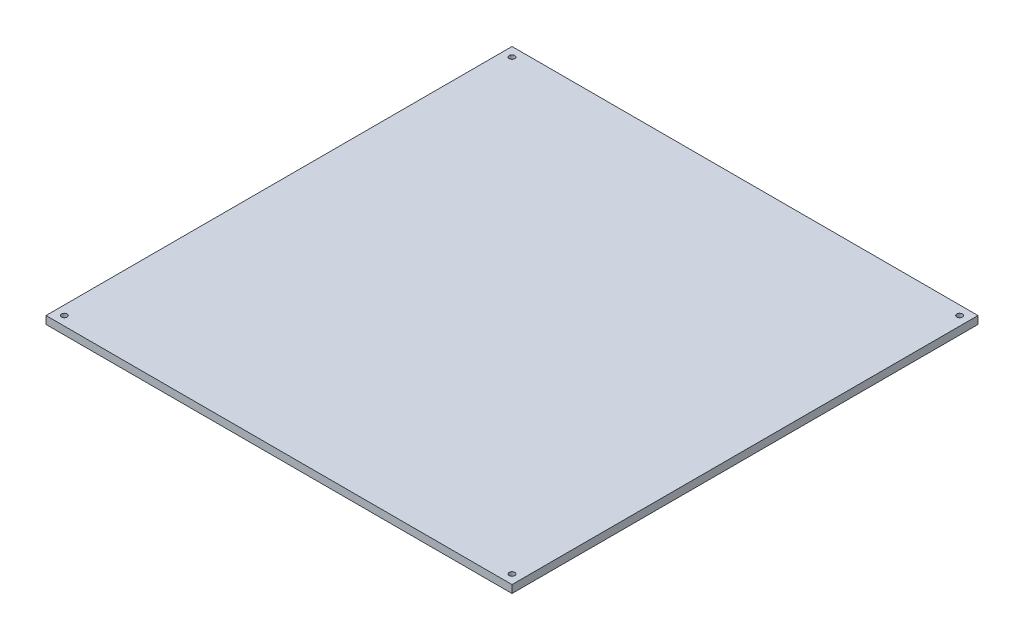
ISO-10303-21;
HEADER;
FILE_DESCRIPTION(('STEP AP214'),'2;1');
FILE_NAME('part.step','',(''),(''),'','','');
FILE_SCHEMA(('AUTOMOTIVE_DESIGN { 1 0 10303 214 1 1 1 1 }'));
ENDSEC;
DATA;
#1=APPLICATION_CONTEXT('core data for automotive mechanical design processes');
#2=APPLICATION_PROTOCOL_DEFINITION('international standard','automotive_design',2000,#1);
#3=PRODUCT_CONTEXT('',#1,'mechanical');
#4=PRODUCT('Part','Part','',(#3));
#5=PRODUCT_RELATED_PRODUCT_CATEGORY('part','',(#4));
#6=PRODUCT_DEFINITION_FORMATION('','',#4);
#7=PRODUCT_DEFINITION_CONTEXT('part definition',#1,'design');
#8=PRODUCT_DEFINITION('design','',#6,#7);
#9=PRODUCT_DEFINITION_SHAPE('','',#8);
#10=(LENGTH_UNIT() NAMED_UNIT(*) SI_UNIT(.MILLI.,.METRE.));
#11=(NAMED_UNIT(*) PLANE_ANGLE_UNIT() SI_UNIT($,.RADIAN.));
#12=(NAMED_UNIT(*) SI_UNIT($,.STERADIAN.) SOLID_ANGLE_UNIT());
#13=UNCERTAINTY_MEASURE_WITH_UNIT(LENGTH_MEASURE(1.E-05),#10,'distance_accuracy_value','');
#14=(GEOMETRIC_REPRESENTATION_CONTEXT(3) GLOBAL_UNCERTAINTY_ASSIGNED_CONTEXT((#13)) GLOBAL_UNIT_ASSIGNED_CONTEXT((#10,
#11,#12)) REPRESENTATION_CONTEXT('',''));
#15=CARTESIAN_POINT('',(0.,0.,0.));
#16=DIRECTION('',(0.,0.,1.));
#17=DIRECTION('',(1.,0.,0.));
#18=AXIS2_PLACEMENT_3D('',#15,#16,#17);
#19=CARTESIAN_POINT('',(150.,5.,150.));
#20=DIRECTION('',(-1.,0.,0.));
#21=DIRECTION('',(0.,0.,1.));
#22=AXIS2_PLACEMENT_3D('',#19,#20,#21);
#23=PLANE('',#22);
#24=DIRECTION('',(0.,0.,-1.));
#25=VECTOR('',#24,1.);
#26=CARTESIAN_POINT('',(150.,0.,150.));
#27=LINE('',#26,#25);
#28=CARTESIAN_POINT('',(150.,0.,150.));
#29=VERTEX_POINT('',#28);
#30=CARTESIAN_POINT('',(150.,0.,-150.));
#31=VERTEX_POINT('',#30);
#32=EDGE_CURVE('E106',#29,#31,#27,.T.);
#33=ORIENTED_EDGE('',*,*,#32,.T.);
#34=DIRECTION('',(0.,-1.,0.));
#35=VECTOR('',#34,1.);
#36=CARTESIAN_POINT('',(150.,5.,-150.));
#37=LINE('',#36,#35);
#38=CARTESIAN_POINT('',(150.,5.,-150.));
#39=VERTEX_POINT('',#38);
#40=EDGE_CURVE('E11',#39,#31,#37,.T.);
#41=ORIENTED_EDGE('',*,*,#40,.F.);
#42=DIRECTION('',(0.,0.,-1.));
#43=VECTOR('',#42,1.);
#44=CARTESIAN_POINT('',(150.,5.,150.));
#45=LINE('',#44,#43);
#46=CARTESIAN_POINT('',(150.,5.,150.));
#47=VERTEX_POINT('',#46);
#48=EDGE_CURVE('E94',#47,#39,#45,.T.);
#49=ORIENTED_EDGE('',*,*,#48,.F.);
#50=DIRECTION('',(0.,-1.,0.));
#51=VECTOR('',#50,1.);
#52=CARTESIAN_POINT('',(150.,5.,150.));
#53=LINE('',#52,#51);
#54=EDGE_CURVE('E102',#47,#29,#53,.T.);
#55=ORIENTED_EDGE('',*,*,#54,.T.);
#56=EDGE_LOOP('',(#33,#41,#49,#55));
#57=FACE_BOUND('',#56,.T.);
#58=ADVANCED_FACE('F43',(#57),#23,.F.);
#59=CARTESIAN_POINT('',(-150.,5.,-150.));
#60=DIRECTION('',(0.,0.,1.));
#61=DIRECTION('',(1.,0.,0.));
#62=AXIS2_PLACEMENT_3D('',#59,#60,#61);
#63=PLANE('',#62);
#64=DIRECTION('',(-1.,0.,0.));
#65=VECTOR('',#64,1.);
#66=CARTESIAN_POINT('',(-150.,0.,-150.));
#67=LINE('',#66,#65);
#68=CARTESIAN_POINT('',(-150.,0.,-150.));
#69=VERTEX_POINT('',#68);
#70=EDGE_CURVE('E98',#31,#69,#67,.T.);
#71=ORIENTED_EDGE('',*,*,#70,.T.);
#72=DIRECTION('',(0.,-1.,0.));
#73=VECTOR('',#72,1.);
#74=CARTESIAN_POINT('',(-150.,5.,-150.));
#75=LINE('',#74,#73);
#76=CARTESIAN_POINT('',(-150.,5.,-150.));
#77=VERTEX_POINT('',#76);
#78=EDGE_CURVE('E51',#77,#69,#75,.T.);
#79=ORIENTED_EDGE('',*,*,#78,.F.);
#80=DIRECTION('',(-1.,0.,0.));
#81=VECTOR('',#80,1.);
#82=CARTESIAN_POINT('',(-150.,5.,-150.));
#83=LINE('',#82,#81);
#84=EDGE_CURVE('E89',#39,#77,#83,.T.);
#85=ORIENTED_EDGE('',*,*,#84,.F.);
#86=ORIENTED_EDGE('',*,*,#40,.T.);
#87=EDGE_LOOP('',(#71,#79,#85,#86));
#88=FACE_BOUND('',#87,.T.);
#89=ADVANCED_FACE('F97',(#88),#63,.F.);
#90=CARTESIAN_POINT('',(-150.,5.,150.));
#91=DIRECTION('',(1.,0.,0.));
#92=DIRECTION('',(0.,0.,-1.));
#93=AXIS2_PLACEMENT_3D('',#90,#91,#92);
#94=PLANE('',#93);
#95=DIRECTION('',(0.,0.,1.));
#96=VECTOR('',#95,1.);
#97=CARTESIAN_POINT('',(-150.,0.,150.));
#98=LINE('',#97,#96);
#99=CARTESIAN_POINT('',(-150.,0.,150.));
#100=VERTEX_POINT('',#99);
#101=EDGE_CURVE('E76',#69,#100,#98,.T.);
#102=ORIENTED_EDGE('',*,*,#101,.T.);
#103=DIRECTION('',(0.,-1.,0.));
#104=VECTOR('',#103,1.);
#105=CARTESIAN_POINT('',(-150.,5.,150.));
#106=LINE('',#105,#104);
#107=CARTESIAN_POINT('',(-150.,5.,150.));
#108=VERTEX_POINT('',#107);
#109=EDGE_CURVE('E99',#108,#100,#106,.T.);
#110=ORIENTED_EDGE('',*,*,#109,.F.);
#111=DIRECTION('',(0.,0.,1.));
#112=VECTOR('',#111,1.);
#113=CARTESIAN_POINT('',(-150.,5.,150.));
#114=LINE('',#113,#112);
#115=EDGE_CURVE('E92',#77,#108,#114,.T.);
#116=ORIENTED_EDGE('',*,*,#115,.F.);
#117=ORIENTED_EDGE('',*,*,#78,.T.);
#118=EDGE_LOOP('',(#102,#110,#116,#117));
#119=FACE_BOUND('',#118,.T.);
#120=ADVANCED_FACE('F100',(#119),#94,.F.);
#121=CARTESIAN_POINT('',(-150.,5.,150.));
#122=DIRECTION('',(0.,0.,-1.));
#123=DIRECTION('',(-1.,0.,0.));
#124=AXIS2_PLACEMENT_3D('',#121,#122,#123);
#125=PLANE('',#124);
#126=DIRECTION('',(1.,0.,0.));
#127=VECTOR('',#126,1.);
#128=CARTESIAN_POINT('',(-150.,0.,150.));
#129=LINE('',#128,#127);
#130=EDGE_CURVE('E82',#100,#29,#129,.T.);
#131=ORIENTED_EDGE('',*,*,#130,.T.);
#132=ORIENTED_EDGE('',*,*,#54,.F.);
#133=DIRECTION('',(1.,0.,0.));
#134=VECTOR('',#133,1.);
#135=CARTESIAN_POINT('',(-150.,5.,150.));
#136=LINE('',#135,#134);
#137=EDGE_CURVE('E59',#108,#47,#136,.T.);
#138=ORIENTED_EDGE('',*,*,#137,.F.);
#139=ORIENTED_EDGE('',*,*,#109,.T.);
#140=EDGE_LOOP('',(#131,#132,#138,#139));
#141=FACE_BOUND('',#140,.T.);
#142=ADVANCED_FACE('F114',(#141),#125,.F.);
#143=CARTESIAN_POINT('',(0.,5.,0.));
#144=DIRECTION('',(0.,-1.,0.));
#145=DIRECTION('',(0.,0.,-1.));
#146=AXIS2_PLACEMENT_3D('',#143,#144,#145);
#147=PLANE('',#146);
#148=CARTESIAN_POINT('',(144.1,5.,144.1));
#149=DIRECTION('',(0.,-1.,0.));
#150=DIRECTION('',(0.,0.,-1.));
#151=AXIS2_PLACEMENT_3D('',#148,#149,#150);
#152=CIRCLE('',#151,1.8);
#153=CARTESIAN_POINT('',(144.1,5.,142.3));
#154=VERTEX_POINT('',#153);
#155=EDGE_CURVE('E146',#154,#154,#152,.T.);
#156=ORIENTED_EDGE('',*,*,#155,.T.);
#157=EDGE_LOOP('',(#156));
#158=FACE_BOUND('',#157,.T.);
#159=CARTESIAN_POINT('',(-144.1,5.,144.1));
#160=DIRECTION('',(0.,-1.,0.));
#161=DIRECTION('',(0.,0.,-1.));
#162=AXIS2_PLACEMENT_3D('',#159,#160,#161);
#163=CIRCLE('',#162,1.8);
#164=CARTESIAN_POINT('',(-144.1,5.,142.3));
#165=VERTEX_POINT('',#164);
#166=EDGE_CURVE('E137',#165,#165,#163,.T.);
#167=ORIENTED_EDGE('',*,*,#166,.T.);
#168=EDGE_LOOP('',(#167));
#169=FACE_BOUND('',#168,.T.);
#170=CARTESIAN_POINT('',(-144.1,5.,-144.1));
#171=DIRECTION('',(0.,-1.,0.));
#172=DIRECTION('',(0.,0.,-1.));
#173=AXIS2_PLACEMENT_3D('',#170,#171,#172);
#174=CIRCLE('',#173,1.8);
#175=CARTESIAN_POINT('',(-144.1,5.,-145.9));
#176=VERTEX_POINT('',#175);
#177=EDGE_CURVE('E128',#176,#176,#174,.T.);
#178=ORIENTED_EDGE('',*,*,#177,.T.);
#179=EDGE_LOOP('',(#178));
#180=FACE_BOUND('',#179,.T.);
#181=CARTESIAN_POINT('',(144.1,5.,-144.1));
#182=DIRECTION('',(0.,-1.,0.));
#183=DIRECTION('',(0.,0.,-1.));
#184=AXIS2_PLACEMENT_3D('',#181,#182,#183);
#185=CIRCLE('',#184,1.8);
#186=CARTESIAN_POINT('',(144.1,5.,-145.9));
#187=VERTEX_POINT('',#186);
#188=EDGE_CURVE('E109',#187,#187,#185,.T.);
#189=ORIENTED_EDGE('',*,*,#188,.T.);
#190=EDGE_LOOP('',(#189));
#191=FACE_BOUND('',#190,.T.);
#192=ORIENTED_EDGE('',*,*,#48,.T.);
#193=ORIENTED_EDGE('',*,*,#84,.T.);
#194=ORIENTED_EDGE('',*,*,#115,.T.);
#195=ORIENTED_EDGE('',*,*,#137,.T.);
#196=EDGE_LOOP('',(#192,#193,#194,#195));
#197=FACE_BOUND('',#196,.T.);
#198=ADVANCED_FACE('F90',(#158,#169,#180,#191,#197),#147,.F.);
#199=CARTESIAN_POINT('',(0.,0.,0.));
#200=DIRECTION('',(0.,-1.,0.));
#201=DIRECTION('',(0.,0.,-1.));
#202=AXIS2_PLACEMENT_3D('',#199,#200,#201);
#203=PLANE('',#202);
#204=CARTESIAN_POINT('',(144.1,0.,144.1));
#205=DIRECTION('',(0.,-1.,0.));
#206=DIRECTION('',(0.,0.,-1.));
#207=AXIS2_PLACEMENT_3D('',#204,#205,#206);
#208=CIRCLE('',#207,3.15000000000001);
#209=CARTESIAN_POINT('',(144.1,0.,140.95));
#210=VERTEX_POINT('',#209);
#211=EDGE_CURVE('E152',#210,#210,#208,.T.);
#212=ORIENTED_EDGE('',*,*,#211,.F.);
#213=EDGE_LOOP('',(#212));
#214=FACE_BOUND('',#213,.T.);
#215=CARTESIAN_POINT('',(-144.1,0.,144.1));
#216=DIRECTION('',(0.,-1.,0.));
#217=DIRECTION('',(0.,0.,-1.));
#218=AXIS2_PLACEMENT_3D('',#215,#216,#217);
#219=CIRCLE('',#218,3.15000000000001);
#220=CARTESIAN_POINT('',(-144.1,0.,140.95));
#221=VERTEX_POINT('',#220);
#222=EDGE_CURVE('E143',#221,#221,#219,.T.);
#223=ORIENTED_EDGE('',*,*,#222,.F.);
#224=EDGE_LOOP('',(#223));
#225=FACE_BOUND('',#224,.T.);
#226=CARTESIAN_POINT('',(-144.1,0.,-144.1));
#227=DIRECTION('',(0.,-1.,0.));
#228=DIRECTION('',(0.,0.,-1.));
#229=AXIS2_PLACEMENT_3D('',#226,#227,#228);
#230=CIRCLE('',#229,3.15000000000001);
#231=CARTESIAN_POINT('',(-144.1,0.,-147.25));
#232=VERTEX_POINT('',#231);
#233=EDGE_CURVE('E134',#232,#232,#230,.T.);
#234=ORIENTED_EDGE('',*,*,#233,.F.);
#235=EDGE_LOOP('',(#234));
#236=FACE_BOUND('',#235,.T.);
#237=CARTESIAN_POINT('',(144.1,0.,-144.1));
#238=DIRECTION('',(0.,-1.,0.));
#239=DIRECTION('',(0.,0.,-1.));
#240=AXIS2_PLACEMENT_3D('',#237,#238,#239);
#241=CIRCLE('',#240,3.14999999999999);
#242=CARTESIAN_POINT('',(144.1,0.,-147.25));
#243=VERTEX_POINT('',#242);
#244=EDGE_CURVE('E125',#243,#243,#241,.T.);
#245=ORIENTED_EDGE('',*,*,#244,.F.);
#246=EDGE_LOOP('',(#245));
#247=FACE_BOUND('',#246,.T.);
#248=ORIENTED_EDGE('',*,*,#32,.F.);
#249=ORIENTED_EDGE('',*,*,#130,.F.);
#250=ORIENTED_EDGE('',*,*,#101,.F.);
#251=ORIENTED_EDGE('',*,*,#70,.F.);
#252=EDGE_LOOP('',(#248,#249,#250,#251));
#253=FACE_BOUND('',#252,.T.);
#254=ADVANCED_FACE('F117',(#214,#225,#236,#247,#253),#203,.T.);
#255=CARTESIAN_POINT('',(144.1,0.,-144.1));
#256=DIRECTION('',(0.,-1.,0.));
#257=DIRECTION('',(0.,0.,-1.));
#258=AXIS2_PLACEMENT_3D('',#255,#256,#257);
#259=CYLINDRICAL_SURFACE('',#258,1.8);
#260=ORIENTED_EDGE('',*,*,#188,.F.);
#261=EDGE_LOOP('',(#260));
#262=FACE_BOUND('',#261,.T.);
#263=CARTESIAN_POINT('',(144.1,1.35,-144.1));
#264=DIRECTION('',(0.,-1.,0.));
#265=DIRECTION('',(0.,0.,-1.));
#266=AXIS2_PLACEMENT_3D('',#263,#264,#265);
#267=CIRCLE('',#266,1.8);
#268=CARTESIAN_POINT('',(144.1,1.35,-145.9));
#269=VERTEX_POINT('',#268);
#270=EDGE_CURVE('E122',#269,#269,#267,.T.);
#271=ORIENTED_EDGE('',*,*,#270,.T.);
#272=EDGE_LOOP('',(#271));
#273=FACE_BOUND('',#272,.T.);
#274=ADVANCED_FACE('F160',(#262,#273),#259,.F.);
#275=CARTESIAN_POINT('',(144.1,0.,-144.1));
#276=DIRECTION('',(0.,-1.,0.));
#277=DIRECTION('',(0.,0.,-1.));
#278=AXIS2_PLACEMENT_3D('',#275,#276,#277);
#279=CONICAL_SURFACE('',#278,3.14999999999999,0.785398163397445);
#280=ORIENTED_EDGE('',*,*,#270,.F.);
#281=EDGE_LOOP('',(#280));
#282=FACE_BOUND('',#281,.T.);
#283=ORIENTED_EDGE('',*,*,#244,.T.);
#284=EDGE_LOOP('',(#283));
#285=FACE_BOUND('',#284,.T.);
#286=ADVANCED_FACE('F168',(#282,#285),#279,.F.);
#287=CARTESIAN_POINT('',(-144.1,0.,-144.1));
#288=DIRECTION('',(0.,-1.,0.));
#289=DIRECTION('',(0.,0.,-1.));
#290=AXIS2_PLACEMENT_3D('',#287,#288,#289);
#291=CYLINDRICAL_SURFACE('',#290,1.8);
#292=ORIENTED_EDGE('',*,*,#177,.F.);
#293=EDGE_LOOP('',(#292));
#294=FACE_BOUND('',#293,.T.);
#295=CARTESIAN_POINT('',(-144.1,1.35,-144.1));
#296=DIRECTION('',(0.,-1.,0.));
#297=DIRECTION('',(0.,0.,-1.));
#298=AXIS2_PLACEMENT_3D('',#295,#296,#297);
#299=CIRCLE('',#298,1.8);
#300=CARTESIAN_POINT('',(-144.1,1.35,-145.9));
#301=VERTEX_POINT('',#300);
#302=EDGE_CURVE('E131',#301,#301,#299,.T.);
#303=ORIENTED_EDGE('',*,*,#302,.T.);
#304=EDGE_LOOP('',(#303));
#305=FACE_BOUND('',#304,.T.);
#306=ADVANCED_FACE('F170',(#294,#305),#291,.F.);
#307=CARTESIAN_POINT('',(-144.1,0.,-144.1));
#308=DIRECTION('',(0.,-1.,0.));
#309=DIRECTION('',(0.,0.,-1.));
#310=AXIS2_PLACEMENT_3D('',#307,#308,#309);
#311=CONICAL_SURFACE('',#310,3.15000000000001,0.785398163397455);
#312=ORIENTED_EDGE('',*,*,#302,.F.);
#313=EDGE_LOOP('',(#312));
#314=FACE_BOUND('',#313,.T.);
#315=ORIENTED_EDGE('',*,*,#233,.T.);
#316=EDGE_LOOP('',(#315));
#317=FACE_BOUND('',#316,.T.);
#318=ADVANCED_FACE('F177',(#314,#317),#311,.F.);
#319=CARTESIAN_POINT('',(-144.1,0.,144.1));
#320=DIRECTION('',(0.,-1.,0.));
#321=DIRECTION('',(0.,0.,-1.));
#322=AXIS2_PLACEMENT_3D('',#319,#320,#321);
#323=CYLINDRICAL_SURFACE('',#322,1.8);
#324=ORIENTED_EDGE('',*,*,#166,.F.);
#325=EDGE_LOOP('',(#324));
#326=FACE_BOUND('',#325,.T.);
#327=CARTESIAN_POINT('',(-144.1,1.35,144.1));
#328=DIRECTION('',(0.,-1.,0.));
#329=DIRECTION('',(0.,0.,-1.));
#330=AXIS2_PLACEMENT_3D('',#327,#328,#329);
#331=CIRCLE('',#330,1.8);
#332=CARTESIAN_POINT('',(-144.1,1.35,142.3));
#333=VERTEX_POINT('',#332);
#334=EDGE_CURVE('E140',#333,#333,#331,.T.);
#335=ORIENTED_EDGE('',*,*,#334,.T.);
#336=EDGE_LOOP('',(#335));
#337=FACE_BOUND('',#336,.T.);
#338=ADVANCED_FACE('F211',(#326,#337),#323,.F.);
#339=CARTESIAN_POINT('',(-144.1,0.,144.1));
#340=DIRECTION('',(0.,-1.,0.));
#341=DIRECTION('',(0.,0.,-1.));
#342=AXIS2_PLACEMENT_3D('',#339,#340,#341);
#343=CONICAL_SURFACE('',#342,3.15000000000001,0.785398163397455);
#344=ORIENTED_EDGE('',*,*,#334,.F.);
#345=EDGE_LOOP('',(#344));
#346=FACE_BOUND('',#345,.T.);
#347=ORIENTED_EDGE('',*,*,#222,.T.);
#348=EDGE_LOOP('',(#347));
#349=FACE_BOUND('',#348,.T.);
#350=ADVANCED_FACE('F216',(#346,#349),#343,.F.);
#351=CARTESIAN_POINT('',(144.1,0.,144.1));
#352=DIRECTION('',(0.,-1.,0.));
#353=DIRECTION('',(0.,0.,-1.));
#354=AXIS2_PLACEMENT_3D('',#351,#352,#353);
#355=CYLINDRICAL_SURFACE('',#354,1.8);
#356=ORIENTED_EDGE('',*,*,#155,.F.);
#357=EDGE_LOOP('',(#356));
#358=FACE_BOUND('',#357,.T.);
#359=CARTESIAN_POINT('',(144.1,1.35,144.1));
#360=DIRECTION('',(0.,-1.,0.));
#361=DIRECTION('',(0.,0.,-1.));
#362=AXIS2_PLACEMENT_3D('',#359,#360,#361);
#363=CIRCLE('',#362,1.8);
#364=CARTESIAN_POINT('',(144.1,1.35,142.3));
#365=VERTEX_POINT('',#364);
#366=EDGE_CURVE('E149',#365,#365,#363,.T.);
#367=ORIENTED_EDGE('',*,*,#366,.T.);
#368=EDGE_LOOP('',(#367));
#369=FACE_BOUND('',#368,.T.);
#370=ADVANCED_FACE('F222',(#358,#369),#355,.F.);
#371=CARTESIAN_POINT('',(144.1,0.,144.1));
#372=DIRECTION('',(0.,-1.,0.));
#373=DIRECTION('',(0.,0.,-1.));
#374=AXIS2_PLACEMENT_3D('',#371,#372,#373);
#375=CONICAL_SURFACE('',#374,3.15000000000001,0.785398163397455);
#376=ORIENTED_EDGE('',*,*,#366,.F.);
#377=EDGE_LOOP('',(#376));
#378=FACE_BOUND('',#377,.T.);
#379=ORIENTED_EDGE('',*,*,#211,.T.);
#380=EDGE_LOOP('',(#379));
#381=FACE_BOUND('',#380,.T.);
#382=ADVANCED_FACE('F156',(#378,#381),#375,.F.);
#383=CLOSED_SHELL('',(#58,#89,#120,#142,#198,#254,#274,#286,#306,#318,#338,#350,#370,#382));
#384=MANIFOLD_SOLID_BREP('B2',#383);
#385=ADVANCED_BREP_SHAPE_REPRESENTATION('',(#18,#384),#14);
#386=SHAPE_DEFINITION_REPRESENTATION(#9,#385);
ENDSEC;
END-ISO-10303-21;
